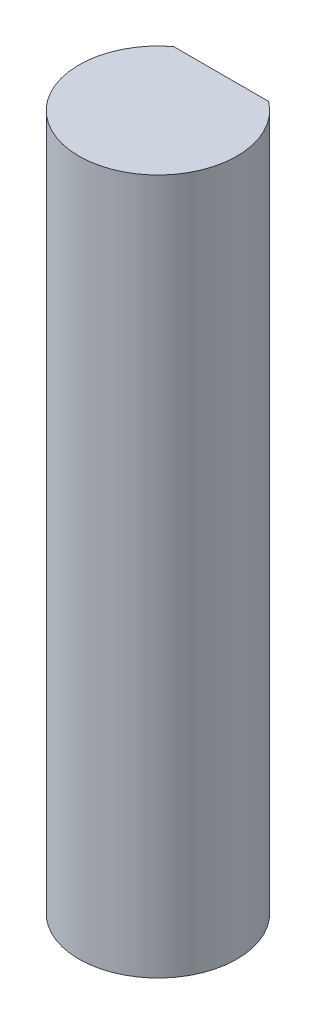
ISO-10303-21;
HEADER;
FILE_DESCRIPTION(('STEP AP214'),'2;1');
FILE_NAME('part.step','',(''),(''),'','','');
FILE_SCHEMA(('AUTOMOTIVE_DESIGN { 1 0 10303 214 1 1 1 1 }'));
ENDSEC;
DATA;
#1=APPLICATION_CONTEXT('core data for automotive mechanical design processes');
#2=APPLICATION_PROTOCOL_DEFINITION('international standard','automotive_design',2000,#1);
#3=PRODUCT_CONTEXT('',#1,'mechanical');
#4=PRODUCT('Part','Part','',(#3));
#5=PRODUCT_RELATED_PRODUCT_CATEGORY('part','',(#4));
#6=PRODUCT_DEFINITION_FORMATION('','',#4);
#7=PRODUCT_DEFINITION_CONTEXT('part definition',#1,'design');
#8=PRODUCT_DEFINITION('design','',#6,#7);
#9=PRODUCT_DEFINITION_SHAPE('','',#8);
#10=(LENGTH_UNIT() NAMED_UNIT(*) SI_UNIT(.MILLI.,.METRE.));
#11=(NAMED_UNIT(*) PLANE_ANGLE_UNIT() SI_UNIT($,.RADIAN.));
#12=(NAMED_UNIT(*) SI_UNIT($,.STERADIAN.) SOLID_ANGLE_UNIT());
#13=UNCERTAINTY_MEASURE_WITH_UNIT(LENGTH_MEASURE(1.E-05),#10,'distance_accuracy_value','');
#14=(GEOMETRIC_REPRESENTATION_CONTEXT(3) GLOBAL_UNCERTAINTY_ASSIGNED_CONTEXT((#13)) GLOBAL_UNIT_ASSIGNED_CONTEXT((#10,
#11,#12)) REPRESENTATION_CONTEXT('',''));
#15=CARTESIAN_POINT('',(0.,0.,0.));
#16=DIRECTION('',(0.,0.,1.));
#17=DIRECTION('',(1.,0.,0.));
#18=AXIS2_PLACEMENT_3D('',#15,#16,#17);
#19=CARTESIAN_POINT('',(0.,22.,-2.));
#20=DIRECTION('',(0.,0.,-1.));
#21=DIRECTION('',(-1.,0.,0.));
#22=AXIS2_PLACEMENT_3D('',#19,#20,#21);
#23=PLANE('',#22);
#24=DIRECTION('',(1.,0.,0.));
#25=VECTOR('',#24,1.);
#26=CARTESIAN_POINT('',(0.,4.,-2.));
#27=LINE('',#26,#25);
#28=CARTESIAN_POINT('',(-1.5,4.,-2.));
#29=VERTEX_POINT('',#28);
#30=CARTESIAN_POINT('',(1.5,4.,-2.));
#31=VERTEX_POINT('',#30);
#32=EDGE_CURVE('E76',#29,#31,#27,.T.);
#33=ORIENTED_EDGE('',*,*,#32,.F.);
#34=DIRECTION('',(0.,-1.,0.));
#35=VECTOR('',#34,1.);
#36=CARTESIAN_POINT('',(-1.5,22.,-2.));
#37=LINE('',#36,#35);
#38=CARTESIAN_POINT('',(-1.5,22.,-2.));
#39=VERTEX_POINT('',#38);
#40=EDGE_CURVE('E11',#39,#29,#37,.T.);
#41=ORIENTED_EDGE('',*,*,#40,.F.);
#42=DIRECTION('',(1.,0.,0.));
#43=VECTOR('',#42,1.);
#44=CARTESIAN_POINT('',(0.,22.,-2.));
#45=LINE('',#44,#43);
#46=CARTESIAN_POINT('',(1.5,22.,-2.));
#47=VERTEX_POINT('',#46);
#48=EDGE_CURVE('E80',#39,#47,#45,.T.);
#49=ORIENTED_EDGE('',*,*,#48,.T.);
#50=DIRECTION('',(0.,-1.,0.));
#51=VECTOR('',#50,1.);
#52=CARTESIAN_POINT('',(1.5,22.,-2.));
#53=LINE('',#52,#51);
#54=EDGE_CURVE('E51',#47,#31,#53,.T.);
#55=ORIENTED_EDGE('',*,*,#54,.T.);
#56=EDGE_LOOP('',(#33,#41,#49,#55));
#57=FACE_BOUND('',#56,.T.);
#58=ADVANCED_FACE('F44',(#57),#23,.T.);
#59=CARTESIAN_POINT('',(0.,22.,0.));
#60=DIRECTION('',(0.,-1.,0.));
#61=DIRECTION('',(0.,0.,-1.));
#62=AXIS2_PLACEMENT_3D('',#59,#60,#61);
#63=CYLINDRICAL_SURFACE('',#62,2.5);
#64=CARTESIAN_POINT('',(0.,0.,0.));
#65=DIRECTION('',(0.,1.,0.));
#66=DIRECTION('',(0.,0.,1.));
#67=AXIS2_PLACEMENT_3D('',#64,#65,#66);
#68=CIRCLE('',#67,2.5);
#69=CARTESIAN_POINT('',(0.,0.,2.5));
#70=VERTEX_POINT('',#69);
#71=EDGE_CURVE('E75',#70,#70,#68,.T.);
#72=ORIENTED_EDGE('',*,*,#71,.T.);
#73=EDGE_LOOP('',(#72));
#74=FACE_BOUND('',#73,.T.);
#75=CARTESIAN_POINT('',(0.,4.,0.));
#76=DIRECTION('',(0.,1.,0.));
#77=DIRECTION('',(0.,0.,1.));
#78=AXIS2_PLACEMENT_3D('',#75,#76,#77);
#79=CIRCLE('',#78,2.5);
#80=EDGE_CURVE('E70',#31,#29,#79,.T.);
#81=ORIENTED_EDGE('',*,*,#80,.F.);
#82=ORIENTED_EDGE('',*,*,#54,.F.);
#83=CARTESIAN_POINT('',(0.,22.,0.));
#84=DIRECTION('',(0.,1.,0.));
#85=DIRECTION('',(0.,0.,1.));
#86=AXIS2_PLACEMENT_3D('',#83,#84,#85);
#87=CIRCLE('',#86,2.5);
#88=EDGE_CURVE('E57',#39,#47,#87,.T.);
#89=ORIENTED_EDGE('',*,*,#88,.F.);
#90=ORIENTED_EDGE('',*,*,#40,.T.);
#91=EDGE_LOOP('',(#81,#82,#89,#90));
#92=FACE_BOUND('',#91,.T.);
#93=ADVANCED_FACE('F72',(#74,#92),#63,.T.);
#94=CARTESIAN_POINT('',(0.,22.,0.));
#95=DIRECTION('',(0.,1.,0.));
#96=DIRECTION('',(0.,0.,1.));
#97=AXIS2_PLACEMENT_3D('',#94,#95,#96);
#98=PLANE('',#97);
#99=ORIENTED_EDGE('',*,*,#48,.F.);
#100=ORIENTED_EDGE('',*,*,#88,.T.);
#101=EDGE_LOOP('',(#99,#100));
#102=FACE_BOUND('',#101,.T.);
#103=ADVANCED_FACE('F90',(#102),#98,.T.);
#104=CARTESIAN_POINT('',(0.,0.,0.));
#105=DIRECTION('',(0.,1.,0.));
#106=DIRECTION('',(0.,0.,1.));
#107=AXIS2_PLACEMENT_3D('',#104,#105,#106);
#108=PLANE('',#107);
#109=ORIENTED_EDGE('',*,*,#71,.F.);
#110=EDGE_LOOP('',(#109));
#111=FACE_BOUND('',#110,.T.);
#112=ADVANCED_FACE('F88',(#111),#108,.F.);
#113=CARTESIAN_POINT('',(0.,4.,0.));
#114=DIRECTION('',(0.,1.,0.));
#115=DIRECTION('',(0.,0.,1.));
#116=AXIS2_PLACEMENT_3D('',#113,#114,#115);
#117=PLANE('',#116);
#118=ORIENTED_EDGE('',*,*,#32,.T.);
#119=ORIENTED_EDGE('',*,*,#80,.T.);
#120=EDGE_LOOP('',(#118,#119));
#121=FACE_BOUND('',#120,.T.);
#122=ADVANCED_FACE('F78',(#121),#117,.T.);
#123=CLOSED_SHELL('',(#58,#93,#103,#112,#122));
#124=MANIFOLD_SOLID_BREP('B2',#123);
#125=ADVANCED_BREP_SHAPE_REPRESENTATION('',(#18,#124),#14);
#126=SHAPE_DEFINITION_REPRESENTATION(#9,#125);
ENDSEC;
END-ISO-10303-21;
